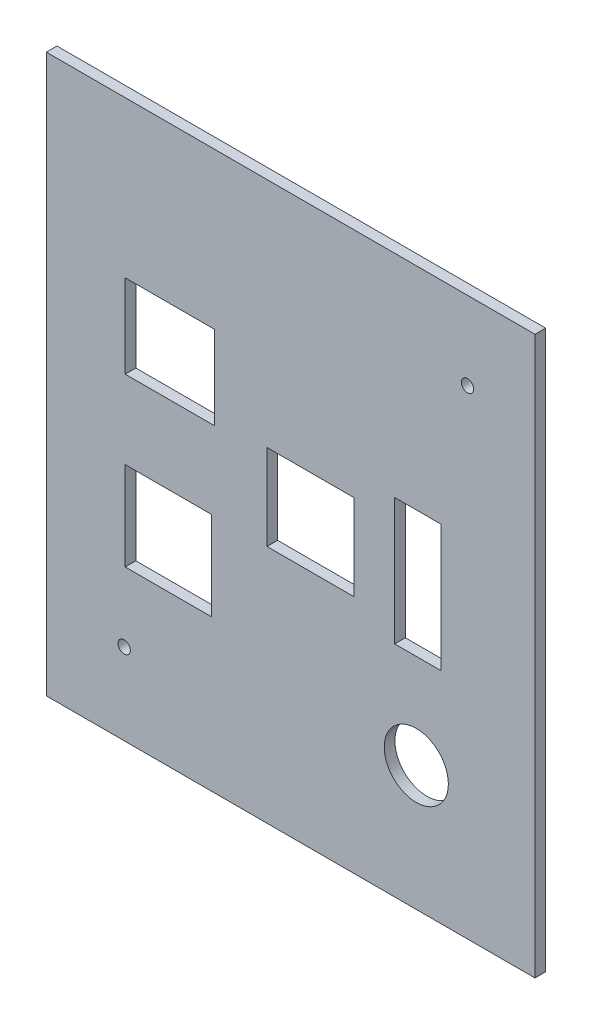
ISO-10303-21;
HEADER;
FILE_DESCRIPTION(('STEP AP214'),'2;1');
FILE_NAME('part.step','',(''),(''),'','','');
FILE_SCHEMA(('AUTOMOTIVE_DESIGN { 1 0 10303 214 1 1 1 1 }'));
ENDSEC;
DATA;
#1=APPLICATION_CONTEXT('core data for automotive mechanical design processes');
#2=APPLICATION_PROTOCOL_DEFINITION('international standard','automotive_design',2000,#1);
#3=PRODUCT_CONTEXT('',#1,'mechanical');
#4=PRODUCT('Part','Part','',(#3));
#5=PRODUCT_RELATED_PRODUCT_CATEGORY('part','',(#4));
#6=PRODUCT_DEFINITION_FORMATION('','',#4);
#7=PRODUCT_DEFINITION_CONTEXT('part definition',#1,'design');
#8=PRODUCT_DEFINITION('design','',#6,#7);
#9=PRODUCT_DEFINITION_SHAPE('','',#8);
#10=(LENGTH_UNIT() NAMED_UNIT(*) SI_UNIT(.MILLI.,.METRE.));
#11=(NAMED_UNIT(*) PLANE_ANGLE_UNIT() SI_UNIT($,.RADIAN.));
#12=(NAMED_UNIT(*) SI_UNIT($,.STERADIAN.) SOLID_ANGLE_UNIT());
#13=UNCERTAINTY_MEASURE_WITH_UNIT(LENGTH_MEASURE(1.E-05),#10,'distance_accuracy_value','');
#14=(GEOMETRIC_REPRESENTATION_CONTEXT(3) GLOBAL_UNCERTAINTY_ASSIGNED_CONTEXT((#13)) GLOBAL_UNIT_ASSIGNED_CONTEXT((#10,
#11,#12)) REPRESENTATION_CONTEXT('',''));
#15=CARTESIAN_POINT('',(0.,0.,0.));
#16=DIRECTION('',(0.,0.,1.));
#17=DIRECTION('',(1.,0.,0.));
#18=AXIS2_PLACEMENT_3D('',#15,#16,#17);
#19=CARTESIAN_POINT('',(47.4311212679019,-19.2746651790543,11.4299999999999));
#20=DIRECTION('',(0.,-1.,0.));
#21=DIRECTION('',(0.,0.,-1.));
#22=AXIS2_PLACEMENT_3D('',#19,#20,#21);
#23=PLANE('',#22);
#24=DIRECTION('',(-1.,0.,0.));
#25=VECTOR('',#24,1.);
#26=CARTESIAN_POINT('',(47.4311212679019,-19.2746651790543,8.88999999999988));
#27=LINE('',#26,#25);
#28=CARTESIAN_POINT('',(164.156649141311,-19.2746651790543,8.88999999999988));
#29=VERTEX_POINT('',#28);
#30=CARTESIAN_POINT('',(47.4311212679019,-19.2746651790543,8.88999999999988));
#31=VERTEX_POINT('',#30);
#32=EDGE_CURVE('E315',#29,#31,#27,.T.);
#33=ORIENTED_EDGE('',*,*,#32,.T.);
#34=DIRECTION('',(0.,0.,-1.));
#35=VECTOR('',#34,1.);
#36=CARTESIAN_POINT('',(47.4311212679019,-19.2746651790543,11.4299999999999));
#37=LINE('',#36,#35);
#38=CARTESIAN_POINT('',(47.4311212679019,-19.2746651790543,11.4299999999999));
#39=VERTEX_POINT('',#38);
#40=EDGE_CURVE('E11',#39,#31,#37,.T.);
#41=ORIENTED_EDGE('',*,*,#40,.F.);
#42=DIRECTION('',(-1.,0.,0.));
#43=VECTOR('',#42,1.);
#44=CARTESIAN_POINT('',(47.4311212679019,-19.2746651790543,11.4299999999999));
#45=LINE('',#44,#43);
#46=CARTESIAN_POINT('',(164.156649141311,-19.2746651790543,11.4299999999999));
#47=VERTEX_POINT('',#46);
#48=EDGE_CURVE('E317',#47,#39,#45,.T.);
#49=ORIENTED_EDGE('',*,*,#48,.F.);
#50=DIRECTION('',(0.,0.,-1.));
#51=VECTOR('',#50,1.);
#52=CARTESIAN_POINT('',(164.156649141311,-19.2746651790543,11.4299999999999));
#53=LINE('',#52,#51);
#54=EDGE_CURVE('E328',#47,#29,#53,.T.);
#55=ORIENTED_EDGE('',*,*,#54,.T.);
#56=EDGE_LOOP('',(#33,#41,#49,#55));
#57=FACE_BOUND('',#56,.T.);
#58=ADVANCED_FACE('F39',(#57),#23,.F.);
#59=CARTESIAN_POINT('',(47.4311212679019,-19.2746651790543,11.4299999999999));
#60=DIRECTION('',(1.,0.,0.));
#61=DIRECTION('',(0.,0.,-1.));
#62=AXIS2_PLACEMENT_3D('',#59,#60,#61);
#63=PLANE('',#62);
#64=DIRECTION('',(0.,-1.,0.));
#65=VECTOR('',#64,1.);
#66=CARTESIAN_POINT('',(47.4311212679019,-19.2746651790543,8.88999999999988));
#67=LINE('',#66,#65);
#68=CARTESIAN_POINT('',(47.4311212679019,-152.439754921389,8.88999999999988));
#69=VERTEX_POINT('',#68);
#70=EDGE_CURVE('E335',#31,#69,#67,.T.);
#71=ORIENTED_EDGE('',*,*,#70,.T.);
#72=DIRECTION('',(0.,0.,-1.));
#73=VECTOR('',#72,1.);
#74=CARTESIAN_POINT('',(47.4311212679019,-152.439754921389,11.4299999999999));
#75=LINE('',#74,#73);
#76=CARTESIAN_POINT('',(47.4311212679019,-152.439754921389,11.4299999999999));
#77=VERTEX_POINT('',#76);
#78=EDGE_CURVE('E50',#77,#69,#75,.T.);
#79=ORIENTED_EDGE('',*,*,#78,.F.);
#80=DIRECTION('',(0.,-1.,0.));
#81=VECTOR('',#80,1.);
#82=CARTESIAN_POINT('',(47.4311212679019,-19.2746651790543,11.4299999999999));
#83=LINE('',#82,#81);
#84=EDGE_CURVE('E325',#39,#77,#83,.T.);
#85=ORIENTED_EDGE('',*,*,#84,.F.);
#86=ORIENTED_EDGE('',*,*,#40,.T.);
#87=EDGE_LOOP('',(#71,#79,#85,#86));
#88=FACE_BOUND('',#87,.T.);
#89=ADVANCED_FACE('F390',(#88),#63,.F.);
#90=CARTESIAN_POINT('',(47.4311212679019,-152.439754921389,11.4299999999999));
#91=DIRECTION('',(0.,1.,0.));
#92=DIRECTION('',(0.,0.,1.));
#93=AXIS2_PLACEMENT_3D('',#90,#91,#92);
#94=PLANE('',#93);
#95=DIRECTION('',(1.,0.,0.));
#96=VECTOR('',#95,1.);
#97=CARTESIAN_POINT('',(47.4311212679019,-152.439754921389,8.88999999999988));
#98=LINE('',#97,#96);
#99=CARTESIAN_POINT('',(164.156649141311,-152.439754921389,8.88999999999988));
#100=VERTEX_POINT('',#99);
#101=EDGE_CURVE('E331',#69,#100,#98,.T.);
#102=ORIENTED_EDGE('',*,*,#101,.T.);
#103=DIRECTION('',(0.,0.,-1.));
#104=VECTOR('',#103,1.);
#105=CARTESIAN_POINT('',(164.156649141311,-152.439754921389,11.4299999999999));
#106=LINE('',#105,#104);
#107=CARTESIAN_POINT('',(164.156649141311,-152.439754921389,11.4299999999999));
#108=VERTEX_POINT('',#107);
#109=EDGE_CURVE('E337',#108,#100,#106,.T.);
#110=ORIENTED_EDGE('',*,*,#109,.F.);
#111=DIRECTION('',(1.,0.,0.));
#112=VECTOR('',#111,1.);
#113=CARTESIAN_POINT('',(47.4311212679019,-152.439754921389,11.4299999999999));
#114=LINE('',#113,#112);
#115=EDGE_CURVE('E324',#77,#108,#114,.T.);
#116=ORIENTED_EDGE('',*,*,#115,.F.);
#117=ORIENTED_EDGE('',*,*,#78,.T.);
#118=EDGE_LOOP('',(#102,#110,#116,#117));
#119=FACE_BOUND('',#118,.T.);
#120=ADVANCED_FACE('F395',(#119),#94,.F.);
#121=CARTESIAN_POINT('',(164.156649141311,-19.2746651790543,11.4299999999999));
#122=DIRECTION('',(-1.,0.,0.));
#123=DIRECTION('',(0.,0.,1.));
#124=AXIS2_PLACEMENT_3D('',#121,#122,#123);
#125=PLANE('',#124);
#126=DIRECTION('',(0.,1.,0.));
#127=VECTOR('',#126,1.);
#128=CARTESIAN_POINT('',(164.156649141311,-19.2746651790543,8.88999999999988));
#129=LINE('',#128,#127);
#130=EDGE_CURVE('E323',#100,#29,#129,.T.);
#131=ORIENTED_EDGE('',*,*,#130,.T.);
#132=ORIENTED_EDGE('',*,*,#54,.F.);
#133=DIRECTION('',(0.,1.,0.));
#134=VECTOR('',#133,1.);
#135=CARTESIAN_POINT('',(164.156649141311,-19.2746651790543,11.4299999999999));
#136=LINE('',#135,#134);
#137=EDGE_CURVE('E330',#108,#47,#136,.T.);
#138=ORIENTED_EDGE('',*,*,#137,.F.);
#139=ORIENTED_EDGE('',*,*,#109,.T.);
#140=EDGE_LOOP('',(#131,#132,#138,#139));
#141=FACE_BOUND('',#140,.T.);
#142=ADVANCED_FACE('F356',(#141),#125,.F.);
#143=CARTESIAN_POINT('',(0.,0.,11.4299999999999));
#144=DIRECTION('',(0.,0.,-1.));
#145=DIRECTION('',(-1.,0.,0.));
#146=AXIS2_PLACEMENT_3D('',#143,#144,#145);
#147=PLANE('',#146);
#148=CARTESIAN_POINT('',(66.0153398773506,-133.007279184641,11.4299999999999));
#149=DIRECTION('',(0.,0.,1.));
#150=DIRECTION('',(1.,0.,0.));
#151=AXIS2_PLACEMENT_3D('',#148,#149,#150);
#152=CIRCLE('',#151,1.475);
#153=CARTESIAN_POINT('',(67.4903398773506,-133.007279184641,11.4299999999999));
#154=VERTEX_POINT('',#153);
#155=EDGE_CURVE('E341',#154,#154,#152,.T.);
#156=ORIENTED_EDGE('',*,*,#155,.F.);
#157=EDGE_LOOP('',(#156));
#158=FACE_BOUND('',#157,.T.);
#159=CARTESIAN_POINT('',(148.032128517678,-37.9645119788566,11.4299999999999));
#160=DIRECTION('',(0.,0.,1.));
#161=DIRECTION('',(1.,0.,0.));
#162=AXIS2_PLACEMENT_3D('',#159,#160,#161);
#163=CIRCLE('',#162,1.47500000000001);
#164=CARTESIAN_POINT('',(149.507128517678,-37.9645119788566,11.4299999999999));
#165=VERTEX_POINT('',#164);
#166=EDGE_CURVE('E203',#165,#165,#163,.T.);
#167=ORIENTED_EDGE('',*,*,#166,.F.);
#168=EDGE_LOOP('',(#167));
#169=FACE_BOUND('',#168,.T.);
#170=DIRECTION('',(1.,0.,0.));
#171=VECTOR('',#170,1.);
#172=CARTESIAN_POINT('',(130.645026118453,-100.086170744965,11.4299999999999));
#173=LINE('',#172,#171);
#174=CARTESIAN_POINT('',(130.645026118453,-100.086170744965,11.4299999999999));
#175=VERTEX_POINT('',#174);
#176=CARTESIAN_POINT('',(141.653532048344,-100.086170744965,11.4299999999999));
#177=VERTEX_POINT('',#176);
#178=EDGE_CURVE('E210',#175,#177,#173,.T.);
#179=ORIENTED_EDGE('',*,*,#178,.F.);
#180=DIRECTION('',(0.,-1.,0.));
#181=VECTOR('',#180,1.);
#182=CARTESIAN_POINT('',(130.645026118453,-100.086170744965,11.4299999999999));
#183=LINE('',#182,#181);
#184=CARTESIAN_POINT('',(130.645026118453,-69.7892569891975,11.4299999999999));
#185=VERTEX_POINT('',#184);
#186=EDGE_CURVE('E54',#185,#175,#183,.T.);
#187=ORIENTED_EDGE('',*,*,#186,.F.);
#188=DIRECTION('',(-1.,0.,0.));
#189=VECTOR('',#188,1.);
#190=CARTESIAN_POINT('',(130.645026118453,-69.7892569891975,11.4299999999999));
#191=LINE('',#190,#189);
#192=CARTESIAN_POINT('',(141.653532048344,-69.7892569891975,11.4299999999999));
#193=VERTEX_POINT('',#192);
#194=EDGE_CURVE('E191',#193,#185,#191,.T.);
#195=ORIENTED_EDGE('',*,*,#194,.F.);
#196=DIRECTION('',(0.,1.,0.));
#197=VECTOR('',#196,1.);
#198=CARTESIAN_POINT('',(141.653532048344,-100.086170744965,11.4299999999999));
#199=LINE('',#198,#197);
#200=EDGE_CURVE('E196',#177,#193,#199,.T.);
#201=ORIENTED_EDGE('',*,*,#200,.F.);
#202=EDGE_LOOP('',(#179,#187,#195,#201));
#203=FACE_BOUND('',#202,.T.);
#204=CARTESIAN_POINT('',(135.800000000031,-122.65,11.4299999999999));
#205=DIRECTION('',(0.,0.,1.));
#206=DIRECTION('',(1.,0.,0.));
#207=AXIS2_PLACEMENT_3D('',#204,#205,#206);
#208=CIRCLE('',#207,7.65695556375051);
#209=CARTESIAN_POINT('',(143.456955563782,-122.65,11.4299999999999));
#210=VERTEX_POINT('',#209);
#211=EDGE_CURVE('E213',#210,#210,#208,.T.);
#212=ORIENTED_EDGE('',*,*,#211,.F.);
#213=EDGE_LOOP('',(#212));
#214=FACE_BOUND('',#213,.T.);
#215=DIRECTION('',(0.,1.,0.));
#216=VECTOR('',#215,1.);
#217=CARTESIAN_POINT('',(87.5711642333751,-76.4735542702588,11.4299999999999));
#218=LINE('',#217,#216);
#219=CARTESIAN_POINT('',(87.5711642333751,-76.4735542702588,11.4299999999999));
#220=VERTEX_POINT('',#219);
#221=CARTESIAN_POINT('',(87.5711642333751,-56.5329098170793,11.4299999999999));
#222=VERTEX_POINT('',#221);
#223=EDGE_CURVE('E272',#220,#222,#218,.T.);
#224=ORIENTED_EDGE('',*,*,#223,.F.);
#225=DIRECTION('',(1.,0.,0.));
#226=VECTOR('',#225,1.);
#227=CARTESIAN_POINT('',(66.2647222149093,-76.4735542702588,11.4299999999999));
#228=LINE('',#227,#226);
#229=CARTESIAN_POINT('',(66.2647222149093,-76.4735542702588,11.4299999999999));
#230=VERTEX_POINT('',#229);
#231=EDGE_CURVE('E232',#230,#220,#228,.T.);
#232=ORIENTED_EDGE('',*,*,#231,.F.);
#233=DIRECTION('',(0.,-1.,0.));
#234=VECTOR('',#233,1.);
#235=CARTESIAN_POINT('',(66.2647222149093,-76.4735542702588,11.4299999999999));
#236=LINE('',#235,#234);
#237=CARTESIAN_POINT('',(66.2647222149093,-56.5329098170793,11.4299999999999));
#238=VERTEX_POINT('',#237);
#239=EDGE_CURVE('E266',#238,#230,#236,.T.);
#240=ORIENTED_EDGE('',*,*,#239,.F.);
#241=DIRECTION('',(-1.,0.,0.));
#242=VECTOR('',#241,1.);
#243=CARTESIAN_POINT('',(66.2647222149093,-56.5329098170793,11.4299999999999));
#244=LINE('',#243,#242);
#245=EDGE_CURVE('E267',#222,#238,#244,.T.);
#246=ORIENTED_EDGE('',*,*,#245,.F.);
#247=EDGE_LOOP('',(#224,#232,#240,#246));
#248=FACE_BOUND('',#247,.T.);
#249=DIRECTION('',(0.,1.,0.));
#250=VECTOR('',#249,1.);
#251=CARTESIAN_POINT('',(120.89662482636,-95.1849809146808,11.4299999999999));
#252=LINE('',#251,#250);
#253=CARTESIAN_POINT('',(120.89662482636,-95.1849809146808,11.4299999999999));
#254=VERTEX_POINT('',#253);
#255=CARTESIAN_POINT('',(120.89662482636,-74.6980174353866,11.4299999999999));
#256=VERTEX_POINT('',#255);
#257=EDGE_CURVE('E243',#254,#256,#252,.T.);
#258=ORIENTED_EDGE('',*,*,#257,.F.);
#259=DIRECTION('',(1.,0.,0.));
#260=VECTOR('',#259,1.);
#261=CARTESIAN_POINT('',(100.136501834009,-95.1849809146808,11.4299999999999));
#262=LINE('',#261,#260);
#263=CARTESIAN_POINT('',(100.136501834009,-95.1849809146808,11.4299999999999));
#264=VERTEX_POINT('',#263);
#265=EDGE_CURVE('E242',#264,#254,#262,.T.);
#266=ORIENTED_EDGE('',*,*,#265,.F.);
#267=DIRECTION('',(0.,-1.,0.));
#268=VECTOR('',#267,1.);
#269=CARTESIAN_POINT('',(100.136501834009,-95.1849809146808,11.4299999999999));
#270=LINE('',#269,#268);
#271=CARTESIAN_POINT('',(100.136501834009,-74.6980174353866,11.4299999999999));
#272=VERTEX_POINT('',#271);
#273=EDGE_CURVE('E235',#272,#264,#270,.T.);
#274=ORIENTED_EDGE('',*,*,#273,.F.);
#275=DIRECTION('',(-1.,0.,0.));
#276=VECTOR('',#275,1.);
#277=CARTESIAN_POINT('',(100.136501834009,-74.6980174353866,11.4299999999999));
#278=LINE('',#277,#276);
#279=EDGE_CURVE('E240',#256,#272,#278,.T.);
#280=ORIENTED_EDGE('',*,*,#279,.F.);
#281=EDGE_LOOP('',(#258,#266,#274,#280));
#282=FACE_BOUND('',#281,.T.);
#283=DIRECTION('',(0.,1.,0.));
#284=VECTOR('',#283,1.);
#285=CARTESIAN_POINT('',(86.888265450732,-116.354843176618,11.4299999999999));
#286=LINE('',#285,#284);
#287=CARTESIAN_POINT('',(86.888265450732,-116.354843176618,11.4299999999999));
#288=VERTEX_POINT('',#287);
#289=CARTESIAN_POINT('',(86.888265450732,-95.1849809146808,11.4299999999999));
#290=VERTEX_POINT('',#289);
#291=EDGE_CURVE('E304',#288,#290,#286,.T.);
#292=ORIENTED_EDGE('',*,*,#291,.F.);
#293=DIRECTION('',(1.,0.,0.));
#294=VECTOR('',#293,1.);
#295=CARTESIAN_POINT('',(66.2647222149093,-116.354843176618,11.4299999999999));
#296=LINE('',#295,#294);
#297=CARTESIAN_POINT('',(66.2647222149093,-116.354843176618,11.4299999999999));
#298=VERTEX_POINT('',#297);
#299=EDGE_CURVE('E248',#298,#288,#296,.T.);
#300=ORIENTED_EDGE('',*,*,#299,.F.);
#301=DIRECTION('',(0.,-1.,0.));
#302=VECTOR('',#301,1.);
#303=CARTESIAN_POINT('',(66.2647222149093,-116.354843176618,11.4299999999999));
#304=LINE('',#303,#302);
#305=CARTESIAN_POINT('',(66.2647222149093,-95.1849809146808,11.4299999999999));
#306=VERTEX_POINT('',#305);
#307=EDGE_CURVE('E292',#306,#298,#304,.T.);
#308=ORIENTED_EDGE('',*,*,#307,.F.);
#309=DIRECTION('',(-1.,0.,0.));
#310=VECTOR('',#309,1.);
#311=CARTESIAN_POINT('',(66.2647222149093,-95.1849809146808,11.4299999999999));
#312=LINE('',#311,#310);
#313=EDGE_CURVE('E301',#290,#306,#312,.T.);
#314=ORIENTED_EDGE('',*,*,#313,.F.);
#315=EDGE_LOOP('',(#292,#300,#308,#314));
#316=FACE_BOUND('',#315,.T.);
#317=ORIENTED_EDGE('',*,*,#48,.T.);
#318=ORIENTED_EDGE('',*,*,#84,.T.);
#319=ORIENTED_EDGE('',*,*,#115,.T.);
#320=ORIENTED_EDGE('',*,*,#137,.T.);
#321=EDGE_LOOP('',(#317,#318,#319,#320));
#322=FACE_BOUND('',#321,.T.);
#323=ADVANCED_FACE('F359',(#158,#169,#203,#214,#248,#282,#316,#322),#147,.F.);
#324=CARTESIAN_POINT('',(0.,0.,8.88999999999988));
#325=DIRECTION('',(0.,0.,-1.));
#326=DIRECTION('',(-1.,0.,0.));
#327=AXIS2_PLACEMENT_3D('',#324,#325,#326);
#328=PLANE('',#327);
#329=CARTESIAN_POINT('',(66.0153398773506,-133.007279184641,8.88999999999988));
#330=DIRECTION('',(0.,0.,-1.));
#331=DIRECTION('',(-1.,0.,0.));
#332=AXIS2_PLACEMENT_3D('',#329,#330,#331);
#333=CIRCLE('',#332,1.475);
#334=CARTESIAN_POINT('',(64.5403398773506,-133.007279184641,8.88999999999988));
#335=VERTEX_POINT('',#334);
#336=EDGE_CURVE('E45',#335,#335,#333,.T.);
#337=ORIENTED_EDGE('',*,*,#336,.F.);
#338=EDGE_LOOP('',(#337));
#339=FACE_BOUND('',#338,.T.);
#340=CARTESIAN_POINT('',(148.032128517678,-37.9645119788566,8.88999999999988));
#341=DIRECTION('',(0.,0.,-1.));
#342=DIRECTION('',(-1.,0.,0.));
#343=AXIS2_PLACEMENT_3D('',#340,#341,#342);
#344=CIRCLE('',#343,1.47500000000001);
#345=CARTESIAN_POINT('',(146.557128517678,-37.9645119788566,8.88999999999988));
#346=VERTEX_POINT('',#345);
#347=EDGE_CURVE('E342',#346,#346,#344,.T.);
#348=ORIENTED_EDGE('',*,*,#347,.F.);
#349=EDGE_LOOP('',(#348));
#350=FACE_BOUND('',#349,.T.);
#351=DIRECTION('',(0.,-1.,0.));
#352=VECTOR('',#351,1.);
#353=CARTESIAN_POINT('',(130.645026118453,-100.086170744965,8.88999999999988));
#354=LINE('',#353,#352);
#355=CARTESIAN_POINT('',(130.645026118453,-69.7892569891975,8.88999999999988));
#356=VERTEX_POINT('',#355);
#357=CARTESIAN_POINT('',(130.645026118453,-100.086170744965,8.88999999999988));
#358=VERTEX_POINT('',#357);
#359=EDGE_CURVE('E180',#356,#358,#354,.T.);
#360=ORIENTED_EDGE('',*,*,#359,.T.);
#361=DIRECTION('',(1.,0.,0.));
#362=VECTOR('',#361,1.);
#363=CARTESIAN_POINT('',(130.645026118453,-100.086170744965,8.88999999999988));
#364=LINE('',#363,#362);
#365=CARTESIAN_POINT('',(141.653532048344,-100.086170744965,8.88999999999988));
#366=VERTEX_POINT('',#365);
#367=EDGE_CURVE('E186',#358,#366,#364,.T.);
#368=ORIENTED_EDGE('',*,*,#367,.T.);
#369=DIRECTION('',(0.,1.,0.));
#370=VECTOR('',#369,1.);
#371=CARTESIAN_POINT('',(141.653532048344,-100.086170744965,8.88999999999988));
#372=LINE('',#371,#370);
#373=CARTESIAN_POINT('',(141.653532048344,-69.7892569891975,8.88999999999988));
#374=VERTEX_POINT('',#373);
#375=EDGE_CURVE('E61',#366,#374,#372,.T.);
#376=ORIENTED_EDGE('',*,*,#375,.T.);
#377=DIRECTION('',(-1.,0.,0.));
#378=VECTOR('',#377,1.);
#379=CARTESIAN_POINT('',(130.645026118453,-69.7892569891975,8.88999999999988));
#380=LINE('',#379,#378);
#381=EDGE_CURVE('E183',#374,#356,#380,.T.);
#382=ORIENTED_EDGE('',*,*,#381,.T.);
#383=EDGE_LOOP('',(#360,#368,#376,#382));
#384=FACE_BOUND('',#383,.T.);
#385=CARTESIAN_POINT('',(135.800000000031,-122.65,8.88999999999988));
#386=DIRECTION('',(0.,0.,1.));
#387=DIRECTION('',(1.,0.,0.));
#388=AXIS2_PLACEMENT_3D('',#385,#386,#387);
#389=CIRCLE('',#388,7.65695556375051);
#390=CARTESIAN_POINT('',(143.456955563782,-122.65,8.88999999999988));
#391=VERTEX_POINT('',#390);
#392=EDGE_CURVE('E220',#391,#391,#389,.T.);
#393=ORIENTED_EDGE('',*,*,#392,.T.);
#394=EDGE_LOOP('',(#393));
#395=FACE_BOUND('',#394,.T.);
#396=DIRECTION('',(1.,0.,0.));
#397=VECTOR('',#396,1.);
#398=CARTESIAN_POINT('',(66.2647222149093,-76.4735542702588,8.88999999999988));
#399=LINE('',#398,#397);
#400=CARTESIAN_POINT('',(66.2647222149093,-76.4735542702588,8.88999999999988));
#401=VERTEX_POINT('',#400);
#402=CARTESIAN_POINT('',(87.5711642333751,-76.4735542702588,8.88999999999988));
#403=VERTEX_POINT('',#402);
#404=EDGE_CURVE('E269',#401,#403,#399,.T.);
#405=ORIENTED_EDGE('',*,*,#404,.T.);
#406=DIRECTION('',(0.,1.,0.));
#407=VECTOR('',#406,1.);
#408=CARTESIAN_POINT('',(87.5711642333751,-76.4735542702588,8.88999999999988));
#409=LINE('',#408,#407);
#410=CARTESIAN_POINT('',(87.5711642333751,-56.5329098170793,8.88999999999988));
#411=VERTEX_POINT('',#410);
#412=EDGE_CURVE('E285',#403,#411,#409,.T.);
#413=ORIENTED_EDGE('',*,*,#412,.T.);
#414=DIRECTION('',(-1.,0.,0.));
#415=VECTOR('',#414,1.);
#416=CARTESIAN_POINT('',(66.2647222149093,-56.5329098170793,8.88999999999988));
#417=LINE('',#416,#415);
#418=CARTESIAN_POINT('',(66.2647222149093,-56.5329098170793,8.88999999999988));
#419=VERTEX_POINT('',#418);
#420=EDGE_CURVE('E276',#411,#419,#417,.T.);
#421=ORIENTED_EDGE('',*,*,#420,.T.);
#422=DIRECTION('',(0.,-1.,0.));
#423=VECTOR('',#422,1.);
#424=CARTESIAN_POINT('',(66.2647222149093,-76.4735542702588,8.88999999999988));
#425=LINE('',#424,#423);
#426=EDGE_CURVE('E257',#419,#401,#425,.T.);
#427=ORIENTED_EDGE('',*,*,#426,.T.);
#428=EDGE_LOOP('',(#405,#413,#421,#427));
#429=FACE_BOUND('',#428,.T.);
#430=DIRECTION('',(1.,0.,0.));
#431=VECTOR('',#430,1.);
#432=CARTESIAN_POINT('',(100.136501834009,-95.1849809146808,8.88999999999988));
#433=LINE('',#432,#431);
#434=CARTESIAN_POINT('',(100.136501834009,-95.1849809146808,8.88999999999988));
#435=VERTEX_POINT('',#434);
#436=CARTESIAN_POINT('',(120.89662482636,-95.1849809146808,8.88999999999988));
#437=VERTEX_POINT('',#436);
#438=EDGE_CURVE('E236',#435,#437,#433,.T.);
#439=ORIENTED_EDGE('',*,*,#438,.T.);
#440=DIRECTION('',(0.,1.,0.));
#441=VECTOR('',#440,1.);
#442=CARTESIAN_POINT('',(120.89662482636,-95.1849809146808,8.88999999999988));
#443=LINE('',#442,#441);
#444=CARTESIAN_POINT('',(120.89662482636,-74.6980174353866,8.88999999999988));
#445=VERTEX_POINT('',#444);
#446=EDGE_CURVE('E252',#437,#445,#443,.T.);
#447=ORIENTED_EDGE('',*,*,#446,.T.);
#448=DIRECTION('',(-1.,0.,0.));
#449=VECTOR('',#448,1.);
#450=CARTESIAN_POINT('',(100.136501834009,-74.6980174353866,8.88999999999988));
#451=LINE('',#450,#449);
#452=CARTESIAN_POINT('',(100.136501834009,-74.6980174353866,8.88999999999988));
#453=VERTEX_POINT('',#452);
#454=EDGE_CURVE('E250',#445,#453,#451,.T.);
#455=ORIENTED_EDGE('',*,*,#454,.T.);
#456=DIRECTION('',(0.,-1.,0.));
#457=VECTOR('',#456,1.);
#458=CARTESIAN_POINT('',(100.136501834009,-95.1849809146808,8.88999999999988));
#459=LINE('',#458,#457);
#460=EDGE_CURVE('E228',#453,#435,#459,.T.);
#461=ORIENTED_EDGE('',*,*,#460,.T.);
#462=EDGE_LOOP('',(#439,#447,#455,#461));
#463=FACE_BOUND('',#462,.T.);
#464=DIRECTION('',(1.,0.,0.));
#465=VECTOR('',#464,1.);
#466=CARTESIAN_POINT('',(66.2647222149093,-116.354843176618,8.88999999999988));
#467=LINE('',#466,#465);
#468=CARTESIAN_POINT('',(66.2647222149093,-116.354843176618,8.88999999999988));
#469=VERTEX_POINT('',#468);
#470=CARTESIAN_POINT('',(86.888265450732,-116.354843176618,8.88999999999988));
#471=VERTEX_POINT('',#470);
#472=EDGE_CURVE('E289',#469,#471,#467,.T.);
#473=ORIENTED_EDGE('',*,*,#472,.T.);
#474=DIRECTION('',(0.,1.,0.));
#475=VECTOR('',#474,1.);
#476=CARTESIAN_POINT('',(86.888265450732,-116.354843176618,8.88999999999988));
#477=LINE('',#476,#475);
#478=CARTESIAN_POINT('',(86.888265450732,-95.1849809146808,8.88999999999988));
#479=VERTEX_POINT('',#478);
#480=EDGE_CURVE('E286',#471,#479,#477,.T.);
#481=ORIENTED_EDGE('',*,*,#480,.T.);
#482=DIRECTION('',(-1.,0.,0.));
#483=VECTOR('',#482,1.);
#484=CARTESIAN_POINT('',(66.2647222149093,-95.1849809146808,8.88999999999988));
#485=LINE('',#484,#483);
#486=CARTESIAN_POINT('',(66.2647222149093,-95.1849809146808,8.88999999999988));
#487=VERTEX_POINT('',#486);
#488=EDGE_CURVE('E294',#479,#487,#485,.T.);
#489=ORIENTED_EDGE('',*,*,#488,.T.);
#490=DIRECTION('',(0.,-1.,0.));
#491=VECTOR('',#490,1.);
#492=CARTESIAN_POINT('',(66.2647222149093,-116.354843176618,8.88999999999988));
#493=LINE('',#492,#491);
#494=EDGE_CURVE('E300',#487,#469,#493,.T.);
#495=ORIENTED_EDGE('',*,*,#494,.T.);
#496=EDGE_LOOP('',(#473,#481,#489,#495));
#497=FACE_BOUND('',#496,.T.);
#498=ORIENTED_EDGE('',*,*,#32,.F.);
#499=ORIENTED_EDGE('',*,*,#130,.F.);
#500=ORIENTED_EDGE('',*,*,#101,.F.);
#501=ORIENTED_EDGE('',*,*,#70,.F.);
#502=EDGE_LOOP('',(#498,#499,#500,#501));
#503=FACE_BOUND('',#502,.T.);
#504=ADVANCED_FACE('F194',(#339,#350,#384,#395,#429,#463,#497,#503),#328,.T.);
#505=CARTESIAN_POINT('',(66.2647222149093,-116.354843176618,8.88999999999988));
#506=DIRECTION('',(0.,-1.,0.));
#507=DIRECTION('',(0.,0.,-1.));
#508=AXIS2_PLACEMENT_3D('',#505,#506,#507);
#509=PLANE('',#508);
#510=ORIENTED_EDGE('',*,*,#299,.T.);
#511=DIRECTION('',(0.,0.,1.));
#512=VECTOR('',#511,1.);
#513=CARTESIAN_POINT('',(86.888265450732,-116.354843176618,8.88999999999988));
#514=LINE('',#513,#512);
#515=EDGE_CURVE('E299',#471,#288,#514,.T.);
#516=ORIENTED_EDGE('',*,*,#515,.F.);
#517=ORIENTED_EDGE('',*,*,#472,.F.);
#518=DIRECTION('',(0.,0.,1.));
#519=VECTOR('',#518,1.);
#520=CARTESIAN_POINT('',(66.2647222149093,-116.354843176618,8.88999999999988));
#521=LINE('',#520,#519);
#522=EDGE_CURVE('E309',#469,#298,#521,.T.);
#523=ORIENTED_EDGE('',*,*,#522,.T.);
#524=EDGE_LOOP('',(#510,#516,#517,#523));
#525=FACE_BOUND('',#524,.T.);
#526=ADVANCED_FACE('F399',(#525),#509,.F.);
#527=CARTESIAN_POINT('',(66.2647222149093,-116.354843176618,8.88999999999988));
#528=DIRECTION('',(-1.,0.,0.));
#529=DIRECTION('',(0.,0.,1.));
#530=AXIS2_PLACEMENT_3D('',#527,#528,#529);
#531=PLANE('',#530);
#532=ORIENTED_EDGE('',*,*,#307,.T.);
#533=ORIENTED_EDGE('',*,*,#522,.F.);
#534=ORIENTED_EDGE('',*,*,#494,.F.);
#535=DIRECTION('',(0.,0.,1.));
#536=VECTOR('',#535,1.);
#537=CARTESIAN_POINT('',(66.2647222149093,-95.1849809146808,8.88999999999988));
#538=LINE('',#537,#536);
#539=EDGE_CURVE('E311',#487,#306,#538,.T.);
#540=ORIENTED_EDGE('',*,*,#539,.T.);
#541=EDGE_LOOP('',(#532,#533,#534,#540));
#542=FACE_BOUND('',#541,.T.);
#543=ADVANCED_FACE('F404',(#542),#531,.F.);
#544=CARTESIAN_POINT('',(66.2647222149093,-95.1849809146808,8.88999999999988));
#545=DIRECTION('',(0.,1.,0.));
#546=DIRECTION('',(0.,0.,1.));
#547=AXIS2_PLACEMENT_3D('',#544,#545,#546);
#548=PLANE('',#547);
#549=ORIENTED_EDGE('',*,*,#313,.T.);
#550=ORIENTED_EDGE('',*,*,#539,.F.);
#551=ORIENTED_EDGE('',*,*,#488,.F.);
#552=DIRECTION('',(0.,0.,1.));
#553=VECTOR('',#552,1.);
#554=CARTESIAN_POINT('',(86.888265450732,-95.1849809146808,8.88999999999988));
#555=LINE('',#554,#553);
#556=EDGE_CURVE('E312',#479,#290,#555,.T.);
#557=ORIENTED_EDGE('',*,*,#556,.T.);
#558=EDGE_LOOP('',(#549,#550,#551,#557));
#559=FACE_BOUND('',#558,.T.);
#560=ADVANCED_FACE('F436',(#559),#548,.F.);
#561=CARTESIAN_POINT('',(86.888265450732,-116.354843176618,8.88999999999988));
#562=DIRECTION('',(1.,0.,0.));
#563=DIRECTION('',(0.,0.,-1.));
#564=AXIS2_PLACEMENT_3D('',#561,#562,#563);
#565=PLANE('',#564);
#566=ORIENTED_EDGE('',*,*,#291,.T.);
#567=ORIENTED_EDGE('',*,*,#556,.F.);
#568=ORIENTED_EDGE('',*,*,#480,.F.);
#569=ORIENTED_EDGE('',*,*,#515,.T.);
#570=EDGE_LOOP('',(#566,#567,#568,#569));
#571=FACE_BOUND('',#570,.T.);
#572=ADVANCED_FACE('F443',(#571),#565,.F.);
#573=CARTESIAN_POINT('',(100.136501834009,-95.1849809146808,8.88999999999988));
#574=DIRECTION('',(0.,-1.,0.));
#575=DIRECTION('',(0.,0.,-1.));
#576=AXIS2_PLACEMENT_3D('',#573,#574,#575);
#577=PLANE('',#576);
#578=ORIENTED_EDGE('',*,*,#265,.T.);
#579=DIRECTION('',(0.,0.,1.));
#580=VECTOR('',#579,1.);
#581=CARTESIAN_POINT('',(120.89662482636,-95.1849809146808,8.88999999999988));
#582=LINE('',#581,#580);
#583=EDGE_CURVE('E224',#437,#254,#582,.T.);
#584=ORIENTED_EDGE('',*,*,#583,.F.);
#585=ORIENTED_EDGE('',*,*,#438,.F.);
#586=DIRECTION('',(0.,0.,1.));
#587=VECTOR('',#586,1.);
#588=CARTESIAN_POINT('',(100.136501834009,-95.1849809146808,8.88999999999988));
#589=LINE('',#588,#587);
#590=EDGE_CURVE('E233',#435,#264,#589,.T.);
#591=ORIENTED_EDGE('',*,*,#590,.T.);
#592=EDGE_LOOP('',(#578,#584,#585,#591));
#593=FACE_BOUND('',#592,.T.);
#594=ADVANCED_FACE('F455',(#593),#577,.F.);
#595=CARTESIAN_POINT('',(100.136501834009,-95.1849809146808,8.88999999999988));
#596=DIRECTION('',(-1.,0.,0.));
#597=DIRECTION('',(0.,0.,1.));
#598=AXIS2_PLACEMENT_3D('',#595,#596,#597);
#599=PLANE('',#598);
#600=ORIENTED_EDGE('',*,*,#273,.T.);
#601=ORIENTED_EDGE('',*,*,#590,.F.);
#602=ORIENTED_EDGE('',*,*,#460,.F.);
#603=DIRECTION('',(0.,0.,1.));
#604=VECTOR('',#603,1.);
#605=CARTESIAN_POINT('',(100.136501834009,-74.6980174353866,8.88999999999988));
#606=LINE('',#605,#604);
#607=EDGE_CURVE('E227',#453,#272,#606,.T.);
#608=ORIENTED_EDGE('',*,*,#607,.T.);
#609=EDGE_LOOP('',(#600,#601,#602,#608));
#610=FACE_BOUND('',#609,.T.);
#611=ADVANCED_FACE('F461',(#610),#599,.F.);
#612=CARTESIAN_POINT('',(100.136501834009,-74.6980174353866,8.88999999999988));
#613=DIRECTION('',(0.,1.,0.));
#614=DIRECTION('',(0.,0.,1.));
#615=AXIS2_PLACEMENT_3D('',#612,#613,#614);
#616=PLANE('',#615);
#617=ORIENTED_EDGE('',*,*,#279,.T.);
#618=ORIENTED_EDGE('',*,*,#607,.F.);
#619=ORIENTED_EDGE('',*,*,#454,.F.);
#620=DIRECTION('',(0.,0.,1.));
#621=VECTOR('',#620,1.);
#622=CARTESIAN_POINT('',(120.89662482636,-74.6980174353866,8.88999999999988));
#623=LINE('',#622,#621);
#624=EDGE_CURVE('E230',#445,#256,#623,.T.);
#625=ORIENTED_EDGE('',*,*,#624,.T.);
#626=EDGE_LOOP('',(#617,#618,#619,#625));
#627=FACE_BOUND('',#626,.T.);
#628=ADVANCED_FACE('F472',(#627),#616,.F.);
#629=CARTESIAN_POINT('',(120.89662482636,-95.1849809146808,8.88999999999988));
#630=DIRECTION('',(1.,0.,0.));
#631=DIRECTION('',(0.,0.,-1.));
#632=AXIS2_PLACEMENT_3D('',#629,#630,#631);
#633=PLANE('',#632);
#634=ORIENTED_EDGE('',*,*,#257,.T.);
#635=ORIENTED_EDGE('',*,*,#624,.F.);
#636=ORIENTED_EDGE('',*,*,#446,.F.);
#637=ORIENTED_EDGE('',*,*,#583,.T.);
#638=EDGE_LOOP('',(#634,#635,#636,#637));
#639=FACE_BOUND('',#638,.T.);
#640=ADVANCED_FACE('F481',(#639),#633,.F.);
#641=CARTESIAN_POINT('',(66.2647222149093,-76.4735542702588,8.88999999999988));
#642=DIRECTION('',(0.,-1.,0.));
#643=DIRECTION('',(0.,0.,-1.));
#644=AXIS2_PLACEMENT_3D('',#641,#642,#643);
#645=PLANE('',#644);
#646=ORIENTED_EDGE('',*,*,#231,.T.);
#647=DIRECTION('',(0.,0.,1.));
#648=VECTOR('',#647,1.);
#649=CARTESIAN_POINT('',(87.5711642333751,-76.4735542702588,8.88999999999988));
#650=LINE('',#649,#648);
#651=EDGE_CURVE('E260',#403,#220,#650,.T.);
#652=ORIENTED_EDGE('',*,*,#651,.F.);
#653=ORIENTED_EDGE('',*,*,#404,.F.);
#654=DIRECTION('',(0.,0.,1.));
#655=VECTOR('',#654,1.);
#656=CARTESIAN_POINT('',(66.2647222149093,-76.4735542702588,8.88999999999988));
#657=LINE('',#656,#655);
#658=EDGE_CURVE('E219',#401,#230,#657,.T.);
#659=ORIENTED_EDGE('',*,*,#658,.T.);
#660=EDGE_LOOP('',(#646,#652,#653,#659));
#661=FACE_BOUND('',#660,.T.);
#662=ADVANCED_FACE('F489',(#661),#645,.F.);
#663=CARTESIAN_POINT('',(66.2647222149093,-76.4735542702588,8.88999999999988));
#664=DIRECTION('',(-1.,0.,0.));
#665=DIRECTION('',(0.,0.,1.));
#666=AXIS2_PLACEMENT_3D('',#663,#664,#665);
#667=PLANE('',#666);
#668=ORIENTED_EDGE('',*,*,#239,.T.);
#669=ORIENTED_EDGE('',*,*,#658,.F.);
#670=ORIENTED_EDGE('',*,*,#426,.F.);
#671=DIRECTION('',(0.,0.,1.));
#672=VECTOR('',#671,1.);
#673=CARTESIAN_POINT('',(66.2647222149093,-56.5329098170793,8.88999999999988));
#674=LINE('',#673,#672);
#675=EDGE_CURVE('E263',#419,#238,#674,.T.);
#676=ORIENTED_EDGE('',*,*,#675,.T.);
#677=EDGE_LOOP('',(#668,#669,#670,#676));
#678=FACE_BOUND('',#677,.T.);
#679=ADVANCED_FACE('F496',(#678),#667,.F.);
#680=CARTESIAN_POINT('',(66.2647222149093,-56.5329098170793,8.88999999999988));
#681=DIRECTION('',(0.,1.,0.));
#682=DIRECTION('',(0.,0.,1.));
#683=AXIS2_PLACEMENT_3D('',#680,#681,#682);
#684=PLANE('',#683);
#685=ORIENTED_EDGE('',*,*,#245,.T.);
#686=ORIENTED_EDGE('',*,*,#675,.F.);
#687=ORIENTED_EDGE('',*,*,#420,.F.);
#688=DIRECTION('',(0.,0.,1.));
#689=VECTOR('',#688,1.);
#690=CARTESIAN_POINT('',(87.5711642333751,-56.5329098170793,8.88999999999988));
#691=LINE('',#690,#689);
#692=EDGE_CURVE('E261',#411,#222,#691,.T.);
#693=ORIENTED_EDGE('',*,*,#692,.T.);
#694=EDGE_LOOP('',(#685,#686,#687,#693));
#695=FACE_BOUND('',#694,.T.);
#696=ADVANCED_FACE('F507',(#695),#684,.F.);
#697=CARTESIAN_POINT('',(87.5711642333751,-76.4735542702588,8.88999999999988));
#698=DIRECTION('',(1.,0.,0.));
#699=DIRECTION('',(0.,0.,-1.));
#700=AXIS2_PLACEMENT_3D('',#697,#698,#699);
#701=PLANE('',#700);
#702=ORIENTED_EDGE('',*,*,#223,.T.);
#703=ORIENTED_EDGE('',*,*,#692,.F.);
#704=ORIENTED_EDGE('',*,*,#412,.F.);
#705=ORIENTED_EDGE('',*,*,#651,.T.);
#706=EDGE_LOOP('',(#702,#703,#704,#705));
#707=FACE_BOUND('',#706,.T.);
#708=ADVANCED_FACE('F520',(#707),#701,.F.);
#709=CARTESIAN_POINT('',(135.800000000031,-122.65,8.88999999999988));
#710=DIRECTION('',(0.,0.,1.));
#711=DIRECTION('',(1.,0.,0.));
#712=AXIS2_PLACEMENT_3D('',#709,#710,#711);
#713=CYLINDRICAL_SURFACE('',#712,7.65695556375051);
#714=ORIENTED_EDGE('',*,*,#392,.F.);
#715=EDGE_LOOP('',(#714));
#716=FACE_BOUND('',#715,.T.);
#717=ORIENTED_EDGE('',*,*,#211,.T.);
#718=EDGE_LOOP('',(#717));
#719=FACE_BOUND('',#718,.T.);
#720=ADVANCED_FACE('F528',(#716,#719),#713,.F.);
#721=CARTESIAN_POINT('',(130.645026118453,-100.086170744965,8.88999999999988));
#722=DIRECTION('',(-1.,0.,0.));
#723=DIRECTION('',(0.,0.,1.));
#724=AXIS2_PLACEMENT_3D('',#721,#722,#723);
#725=PLANE('',#724);
#726=ORIENTED_EDGE('',*,*,#186,.T.);
#727=DIRECTION('',(0.,0.,1.));
#728=VECTOR('',#727,1.);
#729=CARTESIAN_POINT('',(130.645026118453,-100.086170744965,8.88999999999988));
#730=LINE('',#729,#728);
#731=EDGE_CURVE('E174',#358,#175,#730,.T.);
#732=ORIENTED_EDGE('',*,*,#731,.F.);
#733=ORIENTED_EDGE('',*,*,#359,.F.);
#734=DIRECTION('',(0.,0.,1.));
#735=VECTOR('',#734,1.);
#736=CARTESIAN_POINT('',(130.645026118453,-69.7892569891975,8.88999999999988));
#737=LINE('',#736,#735);
#738=EDGE_CURVE('E211',#356,#185,#737,.T.);
#739=ORIENTED_EDGE('',*,*,#738,.T.);
#740=EDGE_LOOP('',(#726,#732,#733,#739));
#741=FACE_BOUND('',#740,.T.);
#742=ADVANCED_FACE('F179',(#741),#725,.F.);
#743=CARTESIAN_POINT('',(130.645026118453,-69.7892569891975,8.88999999999988));
#744=DIRECTION('',(0.,1.,0.));
#745=DIRECTION('',(0.,0.,1.));
#746=AXIS2_PLACEMENT_3D('',#743,#744,#745);
#747=PLANE('',#746);
#748=ORIENTED_EDGE('',*,*,#194,.T.);
#749=ORIENTED_EDGE('',*,*,#738,.F.);
#750=ORIENTED_EDGE('',*,*,#381,.F.);
#751=DIRECTION('',(0.,0.,1.));
#752=VECTOR('',#751,1.);
#753=CARTESIAN_POINT('',(141.653532048344,-69.7892569891975,8.88999999999988));
#754=LINE('',#753,#752);
#755=EDGE_CURVE('E212',#374,#193,#754,.T.);
#756=ORIENTED_EDGE('',*,*,#755,.T.);
#757=EDGE_LOOP('',(#748,#749,#750,#756));
#758=FACE_BOUND('',#757,.T.);
#759=ADVANCED_FACE('F543',(#758),#747,.F.);
#760=CARTESIAN_POINT('',(141.653532048344,-100.086170744965,8.88999999999988));
#761=DIRECTION('',(1.,0.,0.));
#762=DIRECTION('',(0.,0.,-1.));
#763=AXIS2_PLACEMENT_3D('',#760,#761,#762);
#764=PLANE('',#763);
#765=ORIENTED_EDGE('',*,*,#200,.T.);
#766=ORIENTED_EDGE('',*,*,#755,.F.);
#767=ORIENTED_EDGE('',*,*,#375,.F.);
#768=DIRECTION('',(0.,0.,1.));
#769=VECTOR('',#768,1.);
#770=CARTESIAN_POINT('',(141.653532048344,-100.086170744965,8.88999999999988));
#771=LINE('',#770,#769);
#772=EDGE_CURVE('E184',#366,#177,#771,.T.);
#773=ORIENTED_EDGE('',*,*,#772,.T.);
#774=EDGE_LOOP('',(#765,#766,#767,#773));
#775=FACE_BOUND('',#774,.T.);
#776=ADVANCED_FACE('F552',(#775),#764,.F.);
#777=CARTESIAN_POINT('',(130.645026118453,-100.086170744965,8.88999999999988));
#778=DIRECTION('',(0.,-1.,0.));
#779=DIRECTION('',(0.,0.,-1.));
#780=AXIS2_PLACEMENT_3D('',#777,#778,#779);
#781=PLANE('',#780);
#782=ORIENTED_EDGE('',*,*,#178,.T.);
#783=ORIENTED_EDGE('',*,*,#772,.F.);
#784=ORIENTED_EDGE('',*,*,#367,.F.);
#785=ORIENTED_EDGE('',*,*,#731,.T.);
#786=EDGE_LOOP('',(#782,#783,#784,#785));
#787=FACE_BOUND('',#786,.T.);
#788=ADVANCED_FACE('F187',(#787),#781,.F.);
#789=CARTESIAN_POINT('',(148.032128517678,-37.9645119788566,8.47999999999988));
#790=DIRECTION('',(0.,0.,1.));
#791=DIRECTION('',(1.,0.,0.));
#792=AXIS2_PLACEMENT_3D('',#789,#790,#791);
#793=CYLINDRICAL_SURFACE('',#792,1.47500000000001);
#794=ORIENTED_EDGE('',*,*,#347,.T.);
#795=EDGE_LOOP('',(#794));
#796=FACE_BOUND('',#795,.T.);
#797=ORIENTED_EDGE('',*,*,#166,.T.);
#798=EDGE_LOOP('',(#797));
#799=FACE_BOUND('',#798,.T.);
#800=ADVANCED_FACE('F354',(#796,#799),#793,.F.);
#801=CARTESIAN_POINT('',(66.0153398773506,-133.007279184641,8.47999999999988));
#802=DIRECTION('',(0.,0.,1.));
#803=DIRECTION('',(1.,0.,0.));
#804=AXIS2_PLACEMENT_3D('',#801,#802,#803);
#805=CYLINDRICAL_SURFACE('',#804,1.475);
#806=ORIENTED_EDGE('',*,*,#336,.T.);
#807=EDGE_LOOP('',(#806));
#808=FACE_BOUND('',#807,.T.);
#809=ORIENTED_EDGE('',*,*,#155,.T.);
#810=EDGE_LOOP('',(#809));
#811=FACE_BOUND('',#810,.T.);
#812=ADVANCED_FACE('F599',(#808,#811),#805,.F.);
#813=CLOSED_SHELL('',(#58,#89,#120,#142,#323,#504,#526,#543,#560,#572,#594,#611,#628,#640,#662,
#679,#696,#708,#720,#742,#759,#776,#788,#800,#812));
#814=MANIFOLD_SOLID_BREP('B2',#813);
#815=ADVANCED_BREP_SHAPE_REPRESENTATION('',(#18,#814),#14);
#816=SHAPE_DEFINITION_REPRESENTATION(#9,#815);
ENDSEC;
END-ISO-10303-21;
